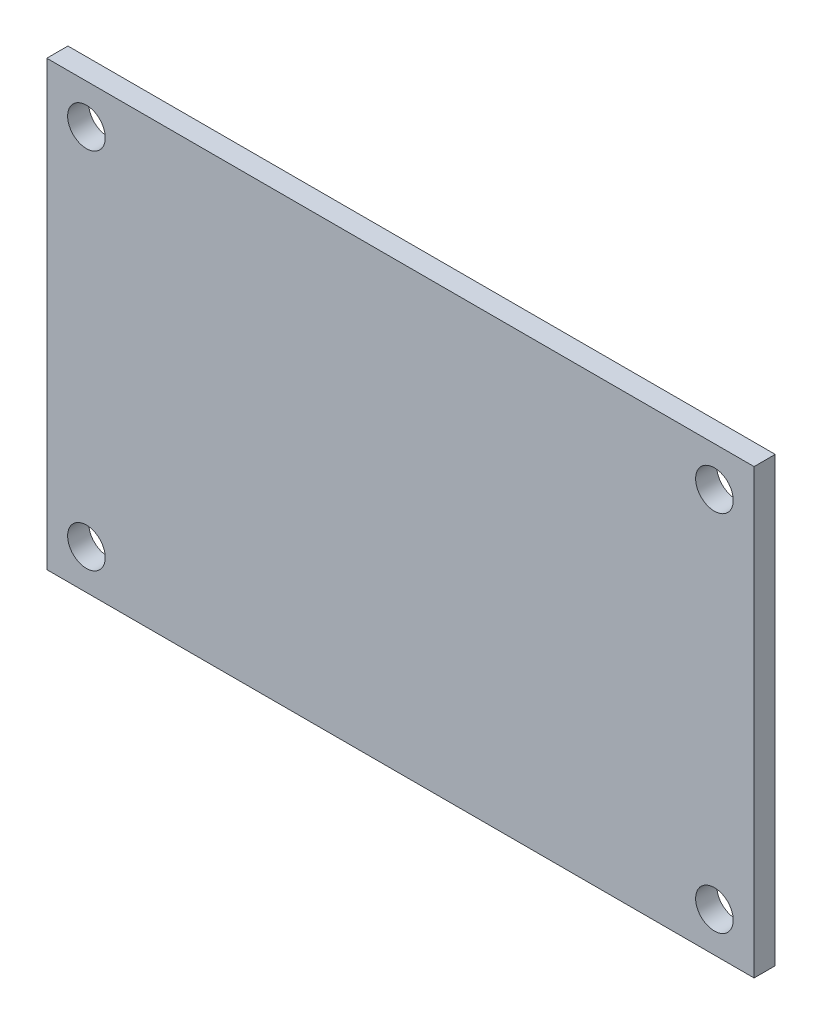
ISO-10303-21;
HEADER;
FILE_DESCRIPTION(('STEP AP214'),'2;1');
FILE_NAME('part.step','',(''),(''),'','','');
FILE_SCHEMA(('AUTOMOTIVE_DESIGN { 1 0 10303 214 1 1 1 1 }'));
ENDSEC;
DATA;
#1=APPLICATION_CONTEXT('core data for automotive mechanical design processes');
#2=APPLICATION_PROTOCOL_DEFINITION('international standard','automotive_design',2000,#1);
#3=PRODUCT_CONTEXT('',#1,'mechanical');
#4=PRODUCT('Part','Part','',(#3));
#5=PRODUCT_RELATED_PRODUCT_CATEGORY('part','',(#4));
#6=PRODUCT_DEFINITION_FORMATION('','',#4);
#7=PRODUCT_DEFINITION_CONTEXT('part definition',#1,'design');
#8=PRODUCT_DEFINITION('design','',#6,#7);
#9=PRODUCT_DEFINITION_SHAPE('','',#8);
#10=(LENGTH_UNIT() NAMED_UNIT(*) SI_UNIT(.MILLI.,.METRE.));
#11=(NAMED_UNIT(*) PLANE_ANGLE_UNIT() SI_UNIT($,.RADIAN.));
#12=(NAMED_UNIT(*) SI_UNIT($,.STERADIAN.) SOLID_ANGLE_UNIT());
#13=UNCERTAINTY_MEASURE_WITH_UNIT(LENGTH_MEASURE(1.E-05),#10,'distance_accuracy_value','');
#14=(GEOMETRIC_REPRESENTATION_CONTEXT(3) GLOBAL_UNCERTAINTY_ASSIGNED_CONTEXT((#13)) GLOBAL_UNIT_ASSIGNED_CONTEXT((#10,
#11,#12)) REPRESENTATION_CONTEXT('',''));
#15=CARTESIAN_POINT('',(0.,0.,0.));
#16=DIRECTION('',(0.,0.,1.));
#17=DIRECTION('',(1.,0.,0.));
#18=AXIS2_PLACEMENT_3D('',#15,#16,#17);
#19=CARTESIAN_POINT('',(0.,0.,1.6));
#20=DIRECTION('',(1.,0.,0.));
#21=DIRECTION('',(0.,1.,0.));
#22=AXIS2_PLACEMENT_3D('',#19,#20,#21);
#23=PLANE('',#22);
#24=DIRECTION('',(0.,-1.,0.));
#25=VECTOR('',#24,1.);
#26=CARTESIAN_POINT('',(0.,0.,0.));
#27=LINE('',#26,#25);
#28=CARTESIAN_POINT('',(0.,0.,0.));
#29=VERTEX_POINT('',#28);
#30=CARTESIAN_POINT('',(0.,-33.5,0.));
#31=VERTEX_POINT('',#30);
#32=EDGE_CURVE('E95',#29,#31,#27,.T.);
#33=ORIENTED_EDGE('',*,*,#32,.T.);
#34=DIRECTION('',(0.,0.,-1.));
#35=VECTOR('',#34,1.);
#36=CARTESIAN_POINT('',(0.,-33.5,1.6));
#37=LINE('',#36,#35);
#38=CARTESIAN_POINT('',(0.,-33.5,1.6));
#39=VERTEX_POINT('',#38);
#40=EDGE_CURVE('E11',#39,#31,#37,.T.);
#41=ORIENTED_EDGE('',*,*,#40,.F.);
#42=DIRECTION('',(0.,-1.,0.));
#43=VECTOR('',#42,1.);
#44=CARTESIAN_POINT('',(0.,0.,1.6));
#45=LINE('',#44,#43);
#46=CARTESIAN_POINT('',(0.,0.,1.6));
#47=VERTEX_POINT('',#46);
#48=EDGE_CURVE('E83',#47,#39,#45,.T.);
#49=ORIENTED_EDGE('',*,*,#48,.F.);
#50=DIRECTION('',(0.,0.,-1.));
#51=VECTOR('',#50,1.);
#52=CARTESIAN_POINT('',(0.,0.,1.6));
#53=LINE('',#52,#51);
#54=EDGE_CURVE('E91',#47,#29,#53,.T.);
#55=ORIENTED_EDGE('',*,*,#54,.T.);
#56=EDGE_LOOP('',(#33,#41,#49,#55));
#57=FACE_BOUND('',#56,.T.);
#58=ADVANCED_FACE('F32',(#57),#23,.F.);
#59=CARTESIAN_POINT('',(0.,-33.5,1.6));
#60=DIRECTION('',(0.,1.,0.));
#61=DIRECTION('',(0.,0.,1.));
#62=AXIS2_PLACEMENT_3D('',#59,#60,#61);
#63=PLANE('',#62);
#64=DIRECTION('',(1.,0.,0.));
#65=VECTOR('',#64,1.);
#66=CARTESIAN_POINT('',(0.,-33.5,0.));
#67=LINE('',#66,#65);
#68=CARTESIAN_POINT('',(53.5,-33.5,0.));
#69=VERTEX_POINT('',#68);
#70=EDGE_CURVE('E87',#31,#69,#67,.T.);
#71=ORIENTED_EDGE('',*,*,#70,.T.);
#72=DIRECTION('',(0.,0.,-1.));
#73=VECTOR('',#72,1.);
#74=CARTESIAN_POINT('',(53.5,-33.5,1.6));
#75=LINE('',#74,#73);
#76=CARTESIAN_POINT('',(53.5,-33.5,1.6));
#77=VERTEX_POINT('',#76);
#78=EDGE_CURVE('E40',#77,#69,#75,.T.);
#79=ORIENTED_EDGE('',*,*,#78,.F.);
#80=DIRECTION('',(1.,0.,0.));
#81=VECTOR('',#80,1.);
#82=CARTESIAN_POINT('',(0.,-33.5,1.6));
#83=LINE('',#82,#81);
#84=EDGE_CURVE('E78',#39,#77,#83,.T.);
#85=ORIENTED_EDGE('',*,*,#84,.F.);
#86=ORIENTED_EDGE('',*,*,#40,.T.);
#87=EDGE_LOOP('',(#71,#79,#85,#86));
#88=FACE_BOUND('',#87,.T.);
#89=ADVANCED_FACE('F86',(#88),#63,.F.);
#90=CARTESIAN_POINT('',(53.5,0.,1.6));
#91=DIRECTION('',(-1.,0.,0.));
#92=DIRECTION('',(0.,-1.,0.));
#93=AXIS2_PLACEMENT_3D('',#90,#91,#92);
#94=PLANE('',#93);
#95=DIRECTION('',(0.,1.,0.));
#96=VECTOR('',#95,1.);
#97=CARTESIAN_POINT('',(53.5,0.,0.));
#98=LINE('',#97,#96);
#99=CARTESIAN_POINT('',(53.5,0.,0.));
#100=VERTEX_POINT('',#99);
#101=EDGE_CURVE('E65',#69,#100,#98,.T.);
#102=ORIENTED_EDGE('',*,*,#101,.T.);
#103=DIRECTION('',(0.,0.,-1.));
#104=VECTOR('',#103,1.);
#105=CARTESIAN_POINT('',(53.5,0.,1.6));
#106=LINE('',#105,#104);
#107=CARTESIAN_POINT('',(53.5,0.,1.6));
#108=VERTEX_POINT('',#107);
#109=EDGE_CURVE('E88',#108,#100,#106,.T.);
#110=ORIENTED_EDGE('',*,*,#109,.F.);
#111=DIRECTION('',(0.,1.,0.));
#112=VECTOR('',#111,1.);
#113=CARTESIAN_POINT('',(53.5,0.,1.6));
#114=LINE('',#113,#112);
#115=EDGE_CURVE('E81',#77,#108,#114,.T.);
#116=ORIENTED_EDGE('',*,*,#115,.F.);
#117=ORIENTED_EDGE('',*,*,#78,.T.);
#118=EDGE_LOOP('',(#102,#110,#116,#117));
#119=FACE_BOUND('',#118,.T.);
#120=ADVANCED_FACE('F89',(#119),#94,.F.);
#121=CARTESIAN_POINT('',(0.,0.,1.6));
#122=DIRECTION('',(0.,-1.,0.));
#123=DIRECTION('',(0.,0.,-1.));
#124=AXIS2_PLACEMENT_3D('',#121,#122,#123);
#125=PLANE('',#124);
#126=DIRECTION('',(-1.,0.,0.));
#127=VECTOR('',#126,1.);
#128=CARTESIAN_POINT('',(0.,0.,0.));
#129=LINE('',#128,#127);
#130=EDGE_CURVE('E71',#100,#29,#129,.T.);
#131=ORIENTED_EDGE('',*,*,#130,.T.);
#132=ORIENTED_EDGE('',*,*,#54,.F.);
#133=DIRECTION('',(-1.,0.,0.));
#134=VECTOR('',#133,1.);
#135=CARTESIAN_POINT('',(0.,0.,1.6));
#136=LINE('',#135,#134);
#137=EDGE_CURVE('E48',#108,#47,#136,.T.);
#138=ORIENTED_EDGE('',*,*,#137,.F.);
#139=ORIENTED_EDGE('',*,*,#109,.T.);
#140=EDGE_LOOP('',(#131,#132,#138,#139));
#141=FACE_BOUND('',#140,.T.);
#142=ADVANCED_FACE('F103',(#141),#125,.F.);
#143=CARTESIAN_POINT('',(0.,0.,1.6));
#144=DIRECTION('',(0.,0.,1.));
#145=DIRECTION('',(1.,0.,0.));
#146=AXIS2_PLACEMENT_3D('',#143,#144,#145);
#147=PLANE('',#146);
#148=CARTESIAN_POINT('',(50.5,-3.,1.6));
#149=DIRECTION('',(0.,0.,1.));
#150=DIRECTION('',(1.,0.,0.));
#151=AXIS2_PLACEMENT_3D('',#148,#149,#150);
#152=CIRCLE('',#151,1.42239999999999);
#153=CARTESIAN_POINT('',(51.9224,-3.,1.6));
#154=VERTEX_POINT('',#153);
#155=EDGE_CURVE('E122',#154,#154,#152,.T.);
#156=ORIENTED_EDGE('',*,*,#155,.F.);
#157=EDGE_LOOP('',(#156));
#158=FACE_BOUND('',#157,.T.);
#159=CARTESIAN_POINT('',(3.,-30.5,1.6));
#160=DIRECTION('',(0.,0.,1.));
#161=DIRECTION('',(1.,0.,0.));
#162=AXIS2_PLACEMENT_3D('',#159,#160,#161);
#163=CIRCLE('',#162,1.4224);
#164=CARTESIAN_POINT('',(4.4224,-30.5,1.6));
#165=VERTEX_POINT('',#164);
#166=EDGE_CURVE('E115',#165,#165,#163,.T.);
#167=ORIENTED_EDGE('',*,*,#166,.F.);
#168=EDGE_LOOP('',(#167));
#169=FACE_BOUND('',#168,.T.);
#170=CARTESIAN_POINT('',(50.5,-30.5,1.6));
#171=DIRECTION('',(0.,0.,1.));
#172=DIRECTION('',(1.,0.,0.));
#173=AXIS2_PLACEMENT_3D('',#170,#171,#172);
#174=CIRCLE('',#173,1.42239999999999);
#175=CARTESIAN_POINT('',(51.9224,-30.5,1.6));
#176=VERTEX_POINT('',#175);
#177=EDGE_CURVE('E127',#176,#176,#174,.T.);
#178=ORIENTED_EDGE('',*,*,#177,.F.);
#179=EDGE_LOOP('',(#178));
#180=FACE_BOUND('',#179,.T.);
#181=CARTESIAN_POINT('',(3.,-3.,1.6));
#182=DIRECTION('',(0.,0.,1.));
#183=DIRECTION('',(1.,0.,0.));
#184=AXIS2_PLACEMENT_3D('',#181,#182,#183);
#185=CIRCLE('',#184,1.4224);
#186=CARTESIAN_POINT('',(4.4224,-3.,1.6));
#187=VERTEX_POINT('',#186);
#188=EDGE_CURVE('E109',#187,#187,#185,.T.);
#189=ORIENTED_EDGE('',*,*,#188,.F.);
#190=EDGE_LOOP('',(#189));
#191=FACE_BOUND('',#190,.T.);
#192=ORIENTED_EDGE('',*,*,#48,.T.);
#193=ORIENTED_EDGE('',*,*,#84,.T.);
#194=ORIENTED_EDGE('',*,*,#115,.T.);
#195=ORIENTED_EDGE('',*,*,#137,.T.);
#196=EDGE_LOOP('',(#192,#193,#194,#195));
#197=FACE_BOUND('',#196,.T.);
#198=ADVANCED_FACE('F79',(#158,#169,#180,#191,#197),#147,.T.);
#199=CARTESIAN_POINT('',(0.,0.,0.));
#200=DIRECTION('',(0.,0.,1.));
#201=DIRECTION('',(1.,0.,0.));
#202=AXIS2_PLACEMENT_3D('',#199,#200,#201);
#203=PLANE('',#202);
#204=CARTESIAN_POINT('',(50.5,-3.,0.));
#205=DIRECTION('',(0.,0.,1.));
#206=DIRECTION('',(1.,0.,0.));
#207=AXIS2_PLACEMENT_3D('',#204,#205,#206);
#208=CIRCLE('',#207,1.42239999999999);
#209=CARTESIAN_POINT('',(51.9224,-3.,0.));
#210=VERTEX_POINT('',#209);
#211=EDGE_CURVE('E112',#210,#210,#208,.T.);
#212=ORIENTED_EDGE('',*,*,#211,.T.);
#213=EDGE_LOOP('',(#212));
#214=FACE_BOUND('',#213,.T.);
#215=CARTESIAN_POINT('',(3.,-30.5,0.));
#216=DIRECTION('',(0.,0.,1.));
#217=DIRECTION('',(1.,0.,0.));
#218=AXIS2_PLACEMENT_3D('',#215,#216,#217);
#219=CIRCLE('',#218,1.4224);
#220=CARTESIAN_POINT('',(4.4224,-30.5,0.));
#221=VERTEX_POINT('',#220);
#222=EDGE_CURVE('E118',#221,#221,#219,.T.);
#223=ORIENTED_EDGE('',*,*,#222,.T.);
#224=EDGE_LOOP('',(#223));
#225=FACE_BOUND('',#224,.T.);
#226=CARTESIAN_POINT('',(50.5,-30.5,0.));
#227=DIRECTION('',(0.,0.,1.));
#228=DIRECTION('',(1.,0.,0.));
#229=AXIS2_PLACEMENT_3D('',#226,#227,#228);
#230=CIRCLE('',#229,1.42239999999999);
#231=CARTESIAN_POINT('',(51.9224,-30.5,0.));
#232=VERTEX_POINT('',#231);
#233=EDGE_CURVE('E119',#232,#232,#230,.T.);
#234=ORIENTED_EDGE('',*,*,#233,.T.);
#235=EDGE_LOOP('',(#234));
#236=FACE_BOUND('',#235,.T.);
#237=CARTESIAN_POINT('',(3.,-3.,0.));
#238=DIRECTION('',(0.,0.,1.));
#239=DIRECTION('',(1.,0.,0.));
#240=AXIS2_PLACEMENT_3D('',#237,#238,#239);
#241=CIRCLE('',#240,1.4224);
#242=CARTESIAN_POINT('',(4.4224,-3.,0.));
#243=VERTEX_POINT('',#242);
#244=EDGE_CURVE('E98',#243,#243,#241,.T.);
#245=ORIENTED_EDGE('',*,*,#244,.T.);
#246=EDGE_LOOP('',(#245));
#247=FACE_BOUND('',#246,.T.);
#248=ORIENTED_EDGE('',*,*,#32,.F.);
#249=ORIENTED_EDGE('',*,*,#130,.F.);
#250=ORIENTED_EDGE('',*,*,#101,.F.);
#251=ORIENTED_EDGE('',*,*,#70,.F.);
#252=EDGE_LOOP('',(#248,#249,#250,#251));
#253=FACE_BOUND('',#252,.T.);
#254=ADVANCED_FACE('F106',(#214,#225,#236,#247,#253),#203,.F.);
#255=CARTESIAN_POINT('',(3.,-3.,0.));
#256=DIRECTION('',(0.,0.,1.));
#257=DIRECTION('',(1.,0.,0.));
#258=AXIS2_PLACEMENT_3D('',#255,#256,#257);
#259=CYLINDRICAL_SURFACE('',#258,1.4224);
#260=ORIENTED_EDGE('',*,*,#244,.F.);
#261=EDGE_LOOP('',(#260));
#262=FACE_BOUND('',#261,.T.);
#263=ORIENTED_EDGE('',*,*,#188,.T.);
#264=EDGE_LOOP('',(#263));
#265=FACE_BOUND('',#264,.T.);
#266=ADVANCED_FACE('F139',(#262,#265),#259,.F.);
#267=CARTESIAN_POINT('',(50.5,-30.5,0.));
#268=DIRECTION('',(0.,0.,1.));
#269=DIRECTION('',(1.,0.,0.));
#270=AXIS2_PLACEMENT_3D('',#267,#268,#269);
#271=CYLINDRICAL_SURFACE('',#270,1.42239999999999);
#272=ORIENTED_EDGE('',*,*,#233,.F.);
#273=EDGE_LOOP('',(#272));
#274=FACE_BOUND('',#273,.T.);
#275=ORIENTED_EDGE('',*,*,#177,.T.);
#276=EDGE_LOOP('',(#275));
#277=FACE_BOUND('',#276,.T.);
#278=ADVANCED_FACE('F135',(#274,#277),#271,.F.);
#279=CARTESIAN_POINT('',(3.,-30.5,0.));
#280=DIRECTION('',(0.,0.,1.));
#281=DIRECTION('',(1.,0.,0.));
#282=AXIS2_PLACEMENT_3D('',#279,#280,#281);
#283=CYLINDRICAL_SURFACE('',#282,1.4224);
#284=ORIENTED_EDGE('',*,*,#222,.F.);
#285=EDGE_LOOP('',(#284));
#286=FACE_BOUND('',#285,.T.);
#287=ORIENTED_EDGE('',*,*,#166,.T.);
#288=EDGE_LOOP('',(#287));
#289=FACE_BOUND('',#288,.T.);
#290=ADVANCED_FACE('F138',(#286,#289),#283,.F.);
#291=CARTESIAN_POINT('',(50.5,-3.,0.));
#292=DIRECTION('',(0.,0.,1.));
#293=DIRECTION('',(1.,0.,0.));
#294=AXIS2_PLACEMENT_3D('',#291,#292,#293);
#295=CYLINDRICAL_SURFACE('',#294,1.42239999999999);
#296=ORIENTED_EDGE('',*,*,#211,.F.);
#297=EDGE_LOOP('',(#296));
#298=FACE_BOUND('',#297,.T.);
#299=ORIENTED_EDGE('',*,*,#155,.T.);
#300=EDGE_LOOP('',(#299));
#301=FACE_BOUND('',#300,.T.);
#302=ADVANCED_FACE('F200',(#298,#301),#295,.F.);
#303=CLOSED_SHELL('',(#58,#89,#120,#142,#198,#254,#266,#278,#290,#302));
#304=MANIFOLD_SOLID_BREP('B2',#303);
#305=ADVANCED_BREP_SHAPE_REPRESENTATION('',(#18,#304),#14);
#306=SHAPE_DEFINITION_REPRESENTATION(#9,#305);
ENDSEC;
END-ISO-10303-21;
